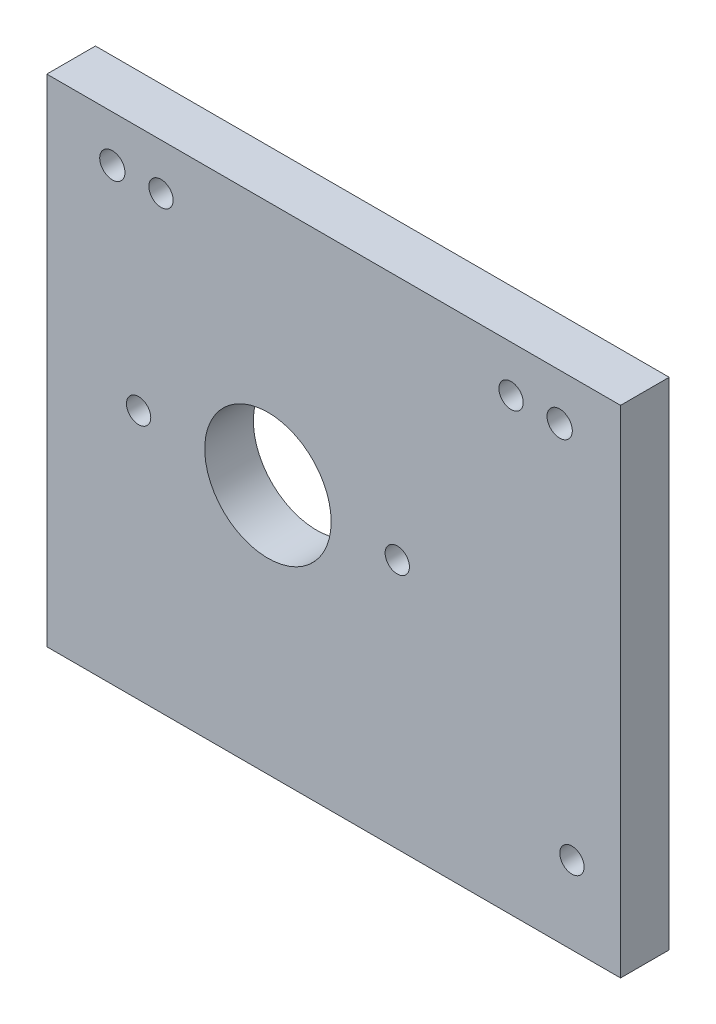
ISO-10303-21;
HEADER;
FILE_DESCRIPTION(('STEP AP214'),'2;1');
FILE_NAME('part.step','',(''),(''),'','','');
FILE_SCHEMA(('AUTOMOTIVE_DESIGN { 1 0 10303 214 1 1 1 1 }'));
ENDSEC;
DATA;
#1=APPLICATION_CONTEXT('core data for automotive mechanical design processes');
#2=APPLICATION_PROTOCOL_DEFINITION('international standard','automotive_design',2000,#1);
#3=PRODUCT_CONTEXT('',#1,'mechanical');
#4=PRODUCT('Part','Part','',(#3));
#5=PRODUCT_RELATED_PRODUCT_CATEGORY('part','',(#4));
#6=PRODUCT_DEFINITION_FORMATION('','',#4);
#7=PRODUCT_DEFINITION_CONTEXT('part definition',#1,'design');
#8=PRODUCT_DEFINITION('design','',#6,#7);
#9=PRODUCT_DEFINITION_SHAPE('','',#8);
#10=(LENGTH_UNIT() NAMED_UNIT(*) SI_UNIT(.MILLI.,.METRE.));
#11=(NAMED_UNIT(*) PLANE_ANGLE_UNIT() SI_UNIT($,.RADIAN.));
#12=(NAMED_UNIT(*) SI_UNIT($,.STERADIAN.) SOLID_ANGLE_UNIT());
#13=UNCERTAINTY_MEASURE_WITH_UNIT(LENGTH_MEASURE(1.E-05),#10,'distance_accuracy_value','');
#14=(GEOMETRIC_REPRESENTATION_CONTEXT(3) GLOBAL_UNCERTAINTY_ASSIGNED_CONTEXT((#13)) GLOBAL_UNIT_ASSIGNED_CONTEXT((#10,
#11,#12)) REPRESENTATION_CONTEXT('',''));
#15=CARTESIAN_POINT('',(0.,0.,0.));
#16=DIRECTION('',(0.,0.,1.));
#17=DIRECTION('',(1.,0.,0.));
#18=AXIS2_PLACEMENT_3D('',#15,#16,#17);
#19=CARTESIAN_POINT('',(-29.7388630515195,0.,5.));
#20=DIRECTION('',(-1.,0.,0.));
#21=DIRECTION('',(0.,-1.,0.));
#22=AXIS2_PLACEMENT_3D('',#19,#20,#21);
#23=PLANE('',#22);
#24=DIRECTION('',(0.,1.,0.));
#25=VECTOR('',#24,1.);
#26=CARTESIAN_POINT('',(-29.7388630515195,0.,0.));
#27=LINE('',#26,#25);
#28=CARTESIAN_POINT('',(-29.7388630515195,-25.7476076649813,0.));
#29=VERTEX_POINT('',#28);
#30=CARTESIAN_POINT('',(-29.7388630515195,25.2523923350187,0.));
#31=VERTEX_POINT('',#30);
#32=EDGE_CURVE('E125',#29,#31,#27,.T.);
#33=ORIENTED_EDGE('',*,*,#32,.F.);
#34=DIRECTION('',(0.,0.,-1.));
#35=VECTOR('',#34,1.);
#36=CARTESIAN_POINT('',(-29.7388630515195,-25.7476076649813,5.));
#37=LINE('',#36,#35);
#38=CARTESIAN_POINT('',(-29.7388630515195,-25.7476076649813,5.));
#39=VERTEX_POINT('',#38);
#40=EDGE_CURVE('E11',#39,#29,#37,.T.);
#41=ORIENTED_EDGE('',*,*,#40,.F.);
#42=DIRECTION('',(0.,1.,0.));
#43=VECTOR('',#42,1.);
#44=CARTESIAN_POINT('',(-29.7388630515195,0.,5.));
#45=LINE('',#44,#43);
#46=CARTESIAN_POINT('',(-29.7388630515195,25.2523923350187,5.));
#47=VERTEX_POINT('',#46);
#48=EDGE_CURVE('E94',#39,#47,#45,.T.);
#49=ORIENTED_EDGE('',*,*,#48,.T.);
#50=DIRECTION('',(0.,0.,-1.));
#51=VECTOR('',#50,1.);
#52=CARTESIAN_POINT('',(-29.7388630515195,25.2523923350187,5.));
#53=LINE('',#52,#51);
#54=EDGE_CURVE('E52',#47,#31,#53,.T.);
#55=ORIENTED_EDGE('',*,*,#54,.T.);
#56=EDGE_LOOP('',(#33,#41,#49,#55));
#57=FACE_BOUND('',#56,.T.);
#58=ADVANCED_FACE('F35',(#57),#23,.T.);
#59=CARTESIAN_POINT('',(0.,-25.7476076649813,5.));
#60=DIRECTION('',(0.,-1.,0.));
#61=DIRECTION('',(0.,0.,-1.));
#62=AXIS2_PLACEMENT_3D('',#59,#60,#61);
#63=PLANE('',#62);
#64=DIRECTION('',(-1.,0.,0.));
#65=VECTOR('',#64,1.);
#66=CARTESIAN_POINT('',(0.,-25.7476076649813,0.));
#67=LINE('',#66,#65);
#68=CARTESIAN_POINT('',(29.2611369484805,-25.7476076649813,0.));
#69=VERTEX_POINT('',#68);
#70=EDGE_CURVE('E84',#69,#29,#67,.T.);
#71=ORIENTED_EDGE('',*,*,#70,.F.);
#72=DIRECTION('',(0.,0.,-1.));
#73=VECTOR('',#72,1.);
#74=CARTESIAN_POINT('',(29.2611369484805,-25.7476076649813,5.));
#75=LINE('',#74,#73);
#76=CARTESIAN_POINT('',(29.2611369484805,-25.7476076649813,5.));
#77=VERTEX_POINT('',#76);
#78=EDGE_CURVE('E44',#77,#69,#75,.T.);
#79=ORIENTED_EDGE('',*,*,#78,.F.);
#80=DIRECTION('',(-1.,0.,0.));
#81=VECTOR('',#80,1.);
#82=CARTESIAN_POINT('',(0.,-25.7476076649813,5.));
#83=LINE('',#82,#81);
#84=EDGE_CURVE('E82',#77,#39,#83,.T.);
#85=ORIENTED_EDGE('',*,*,#84,.T.);
#86=ORIENTED_EDGE('',*,*,#40,.T.);
#87=EDGE_LOOP('',(#71,#79,#85,#86));
#88=FACE_BOUND('',#87,.T.);
#89=ADVANCED_FACE('F80',(#88),#63,.T.);
#90=CARTESIAN_POINT('',(29.2611369484805,0.,5.));
#91=DIRECTION('',(-1.,0.,0.));
#92=DIRECTION('',(0.,-1.,0.));
#93=AXIS2_PLACEMENT_3D('',#90,#91,#92);
#94=PLANE('',#93);
#95=DIRECTION('',(0.,1.,0.));
#96=VECTOR('',#95,1.);
#97=CARTESIAN_POINT('',(29.2611369484805,0.,0.));
#98=LINE('',#97,#96);
#99=CARTESIAN_POINT('',(29.2611369484805,25.2523923350187,0.));
#100=VERTEX_POINT('',#99);
#101=EDGE_CURVE('E128',#69,#100,#98,.T.);
#102=ORIENTED_EDGE('',*,*,#101,.T.);
#103=DIRECTION('',(0.,0.,-1.));
#104=VECTOR('',#103,1.);
#105=CARTESIAN_POINT('',(29.2611369484805,25.2523923350187,5.));
#106=LINE('',#105,#104);
#107=CARTESIAN_POINT('',(29.2611369484805,25.2523923350187,5.));
#108=VERTEX_POINT('',#107);
#109=EDGE_CURVE('E66',#108,#100,#106,.T.);
#110=ORIENTED_EDGE('',*,*,#109,.F.);
#111=DIRECTION('',(0.,1.,0.));
#112=VECTOR('',#111,1.);
#113=CARTESIAN_POINT('',(29.2611369484805,0.,5.));
#114=LINE('',#113,#112);
#115=EDGE_CURVE('E87',#77,#108,#114,.T.);
#116=ORIENTED_EDGE('',*,*,#115,.F.);
#117=ORIENTED_EDGE('',*,*,#78,.T.);
#118=EDGE_LOOP('',(#102,#110,#116,#117));
#119=FACE_BOUND('',#118,.T.);
#120=ADVANCED_FACE('F88',(#119),#94,.F.);
#121=CARTESIAN_POINT('',(-7.,0.,5.));
#122=DIRECTION('',(0.,0.,-1.));
#123=DIRECTION('',(-1.,0.,0.));
#124=AXIS2_PLACEMENT_3D('',#121,#122,#123);
#125=CYLINDRICAL_SURFACE('',#124,6.5);
#126=CARTESIAN_POINT('',(-7.,0.,5.));
#127=DIRECTION('',(0.,0.,1.));
#128=DIRECTION('',(1.,0.,0.));
#129=AXIS2_PLACEMENT_3D('',#126,#127,#128);
#130=CIRCLE('',#129,6.5);
#131=CARTESIAN_POINT('',(-0.5,0.,5.));
#132=VERTEX_POINT('',#131);
#133=EDGE_CURVE('E96',#132,#132,#130,.T.);
#134=ORIENTED_EDGE('',*,*,#133,.T.);
#135=EDGE_LOOP('',(#134));
#136=FACE_BOUND('',#135,.T.);
#137=CARTESIAN_POINT('',(-7.,0.,0.));
#138=DIRECTION('',(0.,0.,1.));
#139=DIRECTION('',(1.,0.,0.));
#140=AXIS2_PLACEMENT_3D('',#137,#138,#139);
#141=CIRCLE('',#140,6.5);
#142=CARTESIAN_POINT('',(-0.5,0.,0.));
#143=VERTEX_POINT('',#142);
#144=EDGE_CURVE('E122',#143,#143,#141,.T.);
#145=ORIENTED_EDGE('',*,*,#144,.F.);
#146=EDGE_LOOP('',(#145));
#147=FACE_BOUND('',#146,.T.);
#148=ADVANCED_FACE('F161',(#136,#147),#125,.F.);
#149=CARTESIAN_POINT('',(-20.3,0.,5.));
#150=DIRECTION('',(0.,0.,-1.));
#151=DIRECTION('',(-1.,0.,0.));
#152=AXIS2_PLACEMENT_3D('',#149,#150,#151);
#153=CYLINDRICAL_SURFACE('',#152,1.25);
#154=CARTESIAN_POINT('',(-20.3,0.,5.));
#155=DIRECTION('',(0.,0.,1.));
#156=DIRECTION('',(1.,0.,0.));
#157=AXIS2_PLACEMENT_3D('',#154,#155,#156);
#158=CIRCLE('',#157,1.25);
#159=CARTESIAN_POINT('',(-19.05,0.,5.));
#160=VERTEX_POINT('',#159);
#161=EDGE_CURVE('E156',#160,#160,#158,.T.);
#162=ORIENTED_EDGE('',*,*,#161,.T.);
#163=EDGE_LOOP('',(#162));
#164=FACE_BOUND('',#163,.T.);
#165=CARTESIAN_POINT('',(-20.3,0.,0.));
#166=DIRECTION('',(0.,0.,1.));
#167=DIRECTION('',(1.,0.,0.));
#168=AXIS2_PLACEMENT_3D('',#165,#166,#167);
#169=CIRCLE('',#168,1.25);
#170=CARTESIAN_POINT('',(-19.05,0.,0.));
#171=VERTEX_POINT('',#170);
#172=EDGE_CURVE('E119',#171,#171,#169,.T.);
#173=ORIENTED_EDGE('',*,*,#172,.F.);
#174=EDGE_LOOP('',(#173));
#175=FACE_BOUND('',#174,.T.);
#176=ADVANCED_FACE('F187',(#164,#175),#153,.F.);
#177=CARTESIAN_POINT('',(6.3,0.,5.));
#178=DIRECTION('',(0.,0.,-1.));
#179=DIRECTION('',(-1.,0.,0.));
#180=AXIS2_PLACEMENT_3D('',#177,#178,#179);
#181=CYLINDRICAL_SURFACE('',#180,1.25);
#182=CARTESIAN_POINT('',(6.3,0.,5.));
#183=DIRECTION('',(0.,0.,1.));
#184=DIRECTION('',(1.,0.,0.));
#185=AXIS2_PLACEMENT_3D('',#182,#183,#184);
#186=CIRCLE('',#185,1.25);
#187=CARTESIAN_POINT('',(7.55,0.,5.));
#188=VERTEX_POINT('',#187);
#189=EDGE_CURVE('E153',#188,#188,#186,.T.);
#190=ORIENTED_EDGE('',*,*,#189,.T.);
#191=EDGE_LOOP('',(#190));
#192=FACE_BOUND('',#191,.T.);
#193=CARTESIAN_POINT('',(6.3,0.,0.));
#194=DIRECTION('',(0.,0.,1.));
#195=DIRECTION('',(1.,0.,0.));
#196=AXIS2_PLACEMENT_3D('',#193,#194,#195);
#197=CIRCLE('',#196,1.25);
#198=CARTESIAN_POINT('',(7.55,0.,0.));
#199=VERTEX_POINT('',#198);
#200=EDGE_CURVE('E116',#199,#199,#197,.T.);
#201=ORIENTED_EDGE('',*,*,#200,.F.);
#202=EDGE_LOOP('',(#201));
#203=FACE_BOUND('',#202,.T.);
#204=ADVANCED_FACE('F190',(#192,#203),#181,.F.);
#205=CARTESIAN_POINT('',(24.2611369484805,-17.7476076649813,5.));
#206=DIRECTION('',(0.,0.,-1.));
#207=DIRECTION('',(-1.,0.,0.));
#208=AXIS2_PLACEMENT_3D('',#205,#206,#207);
#209=CYLINDRICAL_SURFACE('',#208,1.25);
#210=CARTESIAN_POINT('',(24.2611369484805,-17.7476076649813,5.));
#211=DIRECTION('',(0.,0.,1.));
#212=DIRECTION('',(1.,0.,0.));
#213=AXIS2_PLACEMENT_3D('',#210,#211,#212);
#214=CIRCLE('',#213,1.25);
#215=CARTESIAN_POINT('',(25.5111369484805,-17.7476076649813,5.));
#216=VERTEX_POINT('',#215);
#217=EDGE_CURVE('E150',#216,#216,#214,.T.);
#218=ORIENTED_EDGE('',*,*,#217,.T.);
#219=EDGE_LOOP('',(#218));
#220=FACE_BOUND('',#219,.T.);
#221=CARTESIAN_POINT('',(24.2611369484805,-17.7476076649813,0.));
#222=DIRECTION('',(0.,0.,1.));
#223=DIRECTION('',(1.,0.,0.));
#224=AXIS2_PLACEMENT_3D('',#221,#222,#223);
#225=CIRCLE('',#224,1.25);
#226=CARTESIAN_POINT('',(25.5111369484805,-17.7476076649813,0.));
#227=VERTEX_POINT('',#226);
#228=EDGE_CURVE('E113',#227,#227,#225,.T.);
#229=ORIENTED_EDGE('',*,*,#228,.F.);
#230=EDGE_LOOP('',(#229));
#231=FACE_BOUND('',#230,.T.);
#232=ADVANCED_FACE('F194',(#220,#231),#209,.F.);
#233=CARTESIAN_POINT('',(-23.,20.5,5.));
#234=DIRECTION('',(0.,0.,-1.));
#235=DIRECTION('',(-1.,0.,0.));
#236=AXIS2_PLACEMENT_3D('',#233,#234,#235);
#237=CYLINDRICAL_SURFACE('',#236,1.3);
#238=CARTESIAN_POINT('',(-23.,20.5,5.));
#239=DIRECTION('',(0.,0.,1.));
#240=DIRECTION('',(1.,0.,0.));
#241=AXIS2_PLACEMENT_3D('',#238,#239,#240);
#242=CIRCLE('',#241,1.3);
#243=CARTESIAN_POINT('',(-21.7,20.5,5.));
#244=VERTEX_POINT('',#243);
#245=EDGE_CURVE('E147',#244,#244,#242,.T.);
#246=ORIENTED_EDGE('',*,*,#245,.T.);
#247=EDGE_LOOP('',(#246));
#248=FACE_BOUND('',#247,.T.);
#249=CARTESIAN_POINT('',(-23.,20.5,0.));
#250=DIRECTION('',(0.,0.,1.));
#251=DIRECTION('',(1.,0.,0.));
#252=AXIS2_PLACEMENT_3D('',#249,#250,#251);
#253=CIRCLE('',#252,1.3);
#254=CARTESIAN_POINT('',(-21.7,20.5,0.));
#255=VERTEX_POINT('',#254);
#256=EDGE_CURVE('E110',#255,#255,#253,.T.);
#257=ORIENTED_EDGE('',*,*,#256,.F.);
#258=EDGE_LOOP('',(#257));
#259=FACE_BOUND('',#258,.T.);
#260=ADVANCED_FACE('F198',(#248,#259),#237,.F.);
#261=CARTESIAN_POINT('',(-18.,20.5,5.));
#262=DIRECTION('',(0.,0.,-1.));
#263=DIRECTION('',(-1.,0.,0.));
#264=AXIS2_PLACEMENT_3D('',#261,#262,#263);
#265=CYLINDRICAL_SURFACE('',#264,1.25);
#266=CARTESIAN_POINT('',(-18.,20.5,5.));
#267=DIRECTION('',(0.,0.,1.));
#268=DIRECTION('',(1.,0.,0.));
#269=AXIS2_PLACEMENT_3D('',#266,#267,#268);
#270=CIRCLE('',#269,1.25);
#271=CARTESIAN_POINT('',(-16.75,20.5,5.));
#272=VERTEX_POINT('',#271);
#273=EDGE_CURVE('E142',#272,#272,#270,.T.);
#274=ORIENTED_EDGE('',*,*,#273,.T.);
#275=EDGE_LOOP('',(#274));
#276=FACE_BOUND('',#275,.T.);
#277=CARTESIAN_POINT('',(-18.,20.5,0.));
#278=DIRECTION('',(0.,0.,1.));
#279=DIRECTION('',(1.,0.,0.));
#280=AXIS2_PLACEMENT_3D('',#277,#278,#279);
#281=CIRCLE('',#280,1.25);
#282=CARTESIAN_POINT('',(-16.75,20.5,0.));
#283=VERTEX_POINT('',#282);
#284=EDGE_CURVE('E107',#283,#283,#281,.T.);
#285=ORIENTED_EDGE('',*,*,#284,.F.);
#286=EDGE_LOOP('',(#285));
#287=FACE_BOUND('',#286,.T.);
#288=ADVANCED_FACE('F202',(#276,#287),#265,.F.);
#289=CARTESIAN_POINT('',(18.,20.5,5.));
#290=DIRECTION('',(0.,0.,-1.));
#291=DIRECTION('',(-1.,0.,0.));
#292=AXIS2_PLACEMENT_3D('',#289,#290,#291);
#293=CYLINDRICAL_SURFACE('',#292,1.25);
#294=CARTESIAN_POINT('',(18.,20.5,5.));
#295=DIRECTION('',(0.,0.,1.));
#296=DIRECTION('',(1.,0.,0.));
#297=AXIS2_PLACEMENT_3D('',#294,#295,#296);
#298=CIRCLE('',#297,1.25);
#299=CARTESIAN_POINT('',(19.25,20.5,5.));
#300=VERTEX_POINT('',#299);
#301=EDGE_CURVE('E137',#300,#300,#298,.T.);
#302=ORIENTED_EDGE('',*,*,#301,.T.);
#303=EDGE_LOOP('',(#302));
#304=FACE_BOUND('',#303,.T.);
#305=CARTESIAN_POINT('',(18.,20.5,0.));
#306=DIRECTION('',(0.,0.,1.));
#307=DIRECTION('',(1.,0.,0.));
#308=AXIS2_PLACEMENT_3D('',#305,#306,#307);
#309=CIRCLE('',#308,1.25);
#310=CARTESIAN_POINT('',(19.25,20.5,0.));
#311=VERTEX_POINT('',#310);
#312=EDGE_CURVE('E104',#311,#311,#309,.T.);
#313=ORIENTED_EDGE('',*,*,#312,.F.);
#314=EDGE_LOOP('',(#313));
#315=FACE_BOUND('',#314,.T.);
#316=ADVANCED_FACE('F205',(#304,#315),#293,.F.);
#317=CARTESIAN_POINT('',(23.,20.5,5.));
#318=DIRECTION('',(0.,0.,-1.));
#319=DIRECTION('',(-1.,0.,0.));
#320=AXIS2_PLACEMENT_3D('',#317,#318,#319);
#321=CYLINDRICAL_SURFACE('',#320,1.3);
#322=CARTESIAN_POINT('',(23.,20.5,5.));
#323=DIRECTION('',(0.,0.,1.));
#324=DIRECTION('',(1.,0.,0.));
#325=AXIS2_PLACEMENT_3D('',#322,#323,#324);
#326=CIRCLE('',#325,1.3);
#327=CARTESIAN_POINT('',(24.3,20.5,5.));
#328=VERTEX_POINT('',#327);
#329=EDGE_CURVE('E133',#328,#328,#326,.T.);
#330=ORIENTED_EDGE('',*,*,#329,.T.);
#331=EDGE_LOOP('',(#330));
#332=FACE_BOUND('',#331,.T.);
#333=CARTESIAN_POINT('',(23.,20.5,0.));
#334=DIRECTION('',(0.,0.,1.));
#335=DIRECTION('',(1.,0.,0.));
#336=AXIS2_PLACEMENT_3D('',#333,#334,#335);
#337=CIRCLE('',#336,1.3);
#338=CARTESIAN_POINT('',(24.3,20.5,0.));
#339=VERTEX_POINT('',#338);
#340=EDGE_CURVE('E101',#339,#339,#337,.T.);
#341=ORIENTED_EDGE('',*,*,#340,.F.);
#342=EDGE_LOOP('',(#341));
#343=FACE_BOUND('',#342,.T.);
#344=ADVANCED_FACE('F37',(#332,#343),#321,.F.);
#345=CARTESIAN_POINT('',(0.,25.2523923350187,5.));
#346=DIRECTION('',(0.,1.,0.));
#347=DIRECTION('',(0.,0.,1.));
#348=AXIS2_PLACEMENT_3D('',#345,#346,#347);
#349=PLANE('',#348);
#350=DIRECTION('',(1.,0.,0.));
#351=VECTOR('',#350,1.);
#352=CARTESIAN_POINT('',(0.,25.2523923350187,0.));
#353=LINE('',#352,#351);
#354=EDGE_CURVE('E130',#31,#100,#353,.T.);
#355=ORIENTED_EDGE('',*,*,#354,.F.);
#356=ORIENTED_EDGE('',*,*,#54,.F.);
#357=DIRECTION('',(1.,0.,0.));
#358=VECTOR('',#357,1.);
#359=CARTESIAN_POINT('',(0.,25.2523923350187,5.));
#360=LINE('',#359,#358);
#361=EDGE_CURVE('E91',#47,#108,#360,.T.);
#362=ORIENTED_EDGE('',*,*,#361,.T.);
#363=ORIENTED_EDGE('',*,*,#109,.T.);
#364=EDGE_LOOP('',(#355,#356,#362,#363));
#365=FACE_BOUND('',#364,.T.);
#366=ADVANCED_FACE('F166',(#365),#349,.T.);
#367=CARTESIAN_POINT('',(0.,0.,5.));
#368=DIRECTION('',(0.,0.,1.));
#369=DIRECTION('',(1.,0.,0.));
#370=AXIS2_PLACEMENT_3D('',#367,#368,#369);
#371=PLANE('',#370);
#372=ORIENTED_EDGE('',*,*,#329,.F.);
#373=EDGE_LOOP('',(#372));
#374=FACE_BOUND('',#373,.T.);
#375=ORIENTED_EDGE('',*,*,#301,.F.);
#376=EDGE_LOOP('',(#375));
#377=FACE_BOUND('',#376,.T.);
#378=ORIENTED_EDGE('',*,*,#273,.F.);
#379=EDGE_LOOP('',(#378));
#380=FACE_BOUND('',#379,.T.);
#381=ORIENTED_EDGE('',*,*,#245,.F.);
#382=EDGE_LOOP('',(#381));
#383=FACE_BOUND('',#382,.T.);
#384=ORIENTED_EDGE('',*,*,#217,.F.);
#385=EDGE_LOOP('',(#384));
#386=FACE_BOUND('',#385,.T.);
#387=ORIENTED_EDGE('',*,*,#189,.F.);
#388=EDGE_LOOP('',(#387));
#389=FACE_BOUND('',#388,.T.);
#390=ORIENTED_EDGE('',*,*,#161,.F.);
#391=EDGE_LOOP('',(#390));
#392=FACE_BOUND('',#391,.T.);
#393=ORIENTED_EDGE('',*,*,#133,.F.);
#394=EDGE_LOOP('',(#393));
#395=FACE_BOUND('',#394,.T.);
#396=ORIENTED_EDGE('',*,*,#48,.F.);
#397=ORIENTED_EDGE('',*,*,#84,.F.);
#398=ORIENTED_EDGE('',*,*,#115,.T.);
#399=ORIENTED_EDGE('',*,*,#361,.F.);
#400=EDGE_LOOP('',(#396,#397,#398,#399));
#401=FACE_BOUND('',#400,.T.);
#402=ADVANCED_FACE('F93',(#374,#377,#380,#383,#386,#389,#392,#395,#401),#371,.T.);
#403=CARTESIAN_POINT('',(0.,0.,0.));
#404=DIRECTION('',(0.,0.,1.));
#405=DIRECTION('',(1.,0.,0.));
#406=AXIS2_PLACEMENT_3D('',#403,#404,#405);
#407=PLANE('',#406);
#408=ORIENTED_EDGE('',*,*,#340,.T.);
#409=EDGE_LOOP('',(#408));
#410=FACE_BOUND('',#409,.T.);
#411=ORIENTED_EDGE('',*,*,#312,.T.);
#412=EDGE_LOOP('',(#411));
#413=FACE_BOUND('',#412,.T.);
#414=ORIENTED_EDGE('',*,*,#284,.T.);
#415=EDGE_LOOP('',(#414));
#416=FACE_BOUND('',#415,.T.);
#417=ORIENTED_EDGE('',*,*,#256,.T.);
#418=EDGE_LOOP('',(#417));
#419=FACE_BOUND('',#418,.T.);
#420=ORIENTED_EDGE('',*,*,#228,.T.);
#421=EDGE_LOOP('',(#420));
#422=FACE_BOUND('',#421,.T.);
#423=ORIENTED_EDGE('',*,*,#200,.T.);
#424=EDGE_LOOP('',(#423));
#425=FACE_BOUND('',#424,.T.);
#426=ORIENTED_EDGE('',*,*,#172,.T.);
#427=EDGE_LOOP('',(#426));
#428=FACE_BOUND('',#427,.T.);
#429=ORIENTED_EDGE('',*,*,#144,.T.);
#430=EDGE_LOOP('',(#429));
#431=FACE_BOUND('',#430,.T.);
#432=ORIENTED_EDGE('',*,*,#32,.T.);
#433=ORIENTED_EDGE('',*,*,#354,.T.);
#434=ORIENTED_EDGE('',*,*,#101,.F.);
#435=ORIENTED_EDGE('',*,*,#70,.T.);
#436=EDGE_LOOP('',(#432,#433,#434,#435));
#437=FACE_BOUND('',#436,.T.);
#438=ADVANCED_FACE('F165',(#410,#413,#416,#419,#422,#425,#428,#431,#437),#407,.F.);
#439=CLOSED_SHELL('',(#58,#89,#120,#148,#176,#204,#232,#260,#288,#316,#344,#366,#402,#438));
#440=MANIFOLD_SOLID_BREP('B2',#439);
#441=ADVANCED_BREP_SHAPE_REPRESENTATION('',(#18,#440),#14);
#442=SHAPE_DEFINITION_REPRESENTATION(#9,#441);
ENDSEC;
END-ISO-10303-21;
